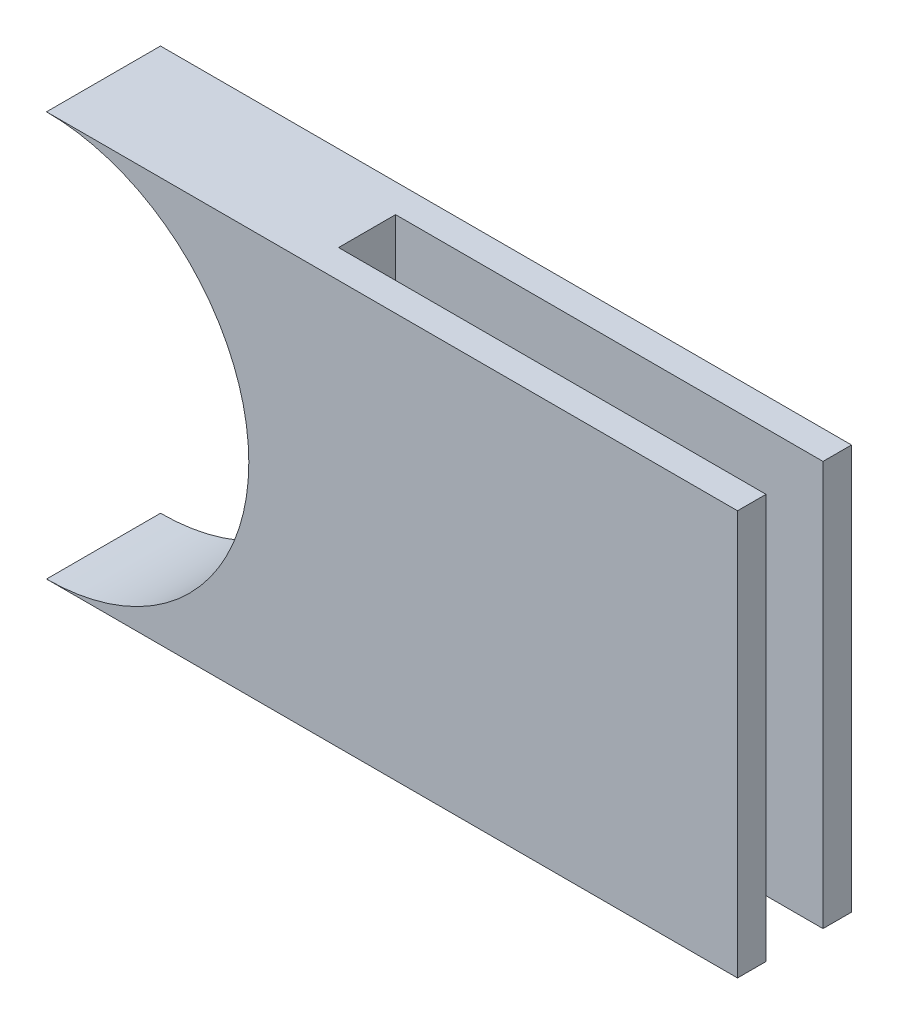
ISO-10303-21;
HEADER;
FILE_DESCRIPTION(('STEP AP214'),'2;1');
FILE_NAME('part.step','',(''),(''),'','','');
FILE_SCHEMA(('AUTOMOTIVE_DESIGN { 1 0 10303 214 1 1 1 1 }'));
ENDSEC;
DATA;
#1=APPLICATION_CONTEXT('core data for automotive mechanical design processes');
#2=APPLICATION_PROTOCOL_DEFINITION('international standard','automotive_design',2000,#1);
#3=PRODUCT_CONTEXT('',#1,'mechanical');
#4=PRODUCT('Part','Part','',(#3));
#5=PRODUCT_RELATED_PRODUCT_CATEGORY('part','',(#4));
#6=PRODUCT_DEFINITION_FORMATION('','',#4);
#7=PRODUCT_DEFINITION_CONTEXT('part definition',#1,'design');
#8=PRODUCT_DEFINITION('design','',#6,#7);
#9=PRODUCT_DEFINITION_SHAPE('','',#8);
#10=(LENGTH_UNIT() NAMED_UNIT(*) SI_UNIT(.MILLI.,.METRE.));
#11=(NAMED_UNIT(*) PLANE_ANGLE_UNIT() SI_UNIT($,.RADIAN.));
#12=(NAMED_UNIT(*) SI_UNIT($,.STERADIAN.) SOLID_ANGLE_UNIT());
#13=UNCERTAINTY_MEASURE_WITH_UNIT(LENGTH_MEASURE(1.E-05),#10,'distance_accuracy_value','');
#14=(GEOMETRIC_REPRESENTATION_CONTEXT(3) GLOBAL_UNCERTAINTY_ASSIGNED_CONTEXT((#13)) GLOBAL_UNIT_ASSIGNED_CONTEXT((#10,
#11,#12)) REPRESENTATION_CONTEXT('',''));
#15=CARTESIAN_POINT('',(0.,0.,0.));
#16=DIRECTION('',(0.,0.,1.));
#17=DIRECTION('',(1.,0.,0.));
#18=AXIS2_PLACEMENT_3D('',#15,#16,#17);
#19=CARTESIAN_POINT('',(61.595,18.034,0.));
#20=DIRECTION('',(1.,0.,0.));
#21=DIRECTION('',(0.,1.,0.));
#22=AXIS2_PLACEMENT_3D('',#19,#20,#21);
#23=PLANE('',#22);
#24=DIRECTION('',(0.,-1.,0.));
#25=VECTOR('',#24,1.);
#26=CARTESIAN_POINT('',(61.595,-18.034,5.08));
#27=LINE('',#26,#25);
#28=CARTESIAN_POINT('',(61.595,18.034,5.08));
#29=VERTEX_POINT('',#28);
#30=CARTESIAN_POINT('',(61.595,-18.034,5.08));
#31=VERTEX_POINT('',#30);
#32=EDGE_CURVE('E172',#29,#31,#27,.T.);
#33=ORIENTED_EDGE('',*,*,#32,.F.);
#34=DIRECTION('',(0.,0.,1.));
#35=VECTOR('',#34,1.);
#36=CARTESIAN_POINT('',(61.595,18.034,0.));
#37=LINE('',#36,#35);
#38=CARTESIAN_POINT('',(61.595,18.034,7.62));
#39=VERTEX_POINT('',#38);
#40=EDGE_CURVE('E149',#29,#39,#37,.T.);
#41=ORIENTED_EDGE('',*,*,#40,.T.);
#42=DIRECTION('',(0.,1.,0.));
#43=VECTOR('',#42,1.);
#44=CARTESIAN_POINT('',(61.595,18.034,7.62));
#45=LINE('',#44,#43);
#46=CARTESIAN_POINT('',(61.595,-18.034,7.62));
#47=VERTEX_POINT('',#46);
#48=EDGE_CURVE('E138',#47,#39,#45,.T.);
#49=ORIENTED_EDGE('',*,*,#48,.F.);
#50=DIRECTION('',(0.,0.,1.));
#51=VECTOR('',#50,1.);
#52=CARTESIAN_POINT('',(61.595,-18.034,0.));
#53=LINE('',#52,#51);
#54=EDGE_CURVE('E150',#31,#47,#53,.T.);
#55=ORIENTED_EDGE('',*,*,#54,.F.);
#56=EDGE_LOOP('',(#33,#41,#49,#55));
#57=FACE_BOUND('',#56,.T.);
#58=ADVANCED_FACE('F34',(#57),#23,.T.);
#59=CARTESIAN_POINT('',(0.,0.,7.62));
#60=DIRECTION('',(0.,0.,1.));
#61=DIRECTION('',(1.,0.,0.));
#62=AXIS2_PLACEMENT_3D('',#59,#60,#61);
#63=PLANE('',#62);
#64=ORIENTED_EDGE('',*,*,#48,.T.);
#65=DIRECTION('',(-1.,0.,0.));
#66=VECTOR('',#65,1.);
#67=CARTESIAN_POINT('',(0.,18.034,7.62));
#68=LINE('',#67,#66);
#69=CARTESIAN_POINT('',(0.,18.034,7.62));
#70=VERTEX_POINT('',#69);
#71=EDGE_CURVE('E141',#39,#70,#68,.T.);
#72=ORIENTED_EDGE('',*,*,#71,.T.);
#73=CARTESIAN_POINT('',(0.,0.,7.62));
#74=DIRECTION('',(0.,0.,1.));
#75=DIRECTION('',(1.,0.,0.));
#76=AXIS2_PLACEMENT_3D('',#73,#74,#75);
#77=CIRCLE('',#76,18.034);
#78=CARTESIAN_POINT('',(0.,-18.034,7.62));
#79=VERTEX_POINT('',#78);
#80=EDGE_CURVE('E12',#79,#70,#77,.T.);
#81=ORIENTED_EDGE('',*,*,#80,.F.);
#82=DIRECTION('',(1.,0.,0.));
#83=VECTOR('',#82,1.);
#84=CARTESIAN_POINT('',(0.,-18.034,7.62));
#85=LINE('',#84,#83);
#86=EDGE_CURVE('E57',#79,#47,#85,.T.);
#87=ORIENTED_EDGE('',*,*,#86,.T.);
#88=EDGE_LOOP('',(#64,#72,#81,#87));
#89=FACE_BOUND('',#88,.T.);
#90=ADVANCED_FACE('F36',(#89),#63,.T.);
#91=CARTESIAN_POINT('',(0.,0.,0.));
#92=DIRECTION('',(0.,0.,1.));
#93=DIRECTION('',(1.,0.,0.));
#94=AXIS2_PLACEMENT_3D('',#91,#92,#93);
#95=CYLINDRICAL_SURFACE('',#94,18.034);
#96=ORIENTED_EDGE('',*,*,#80,.T.);
#97=DIRECTION('',(0.,0.,1.));
#98=VECTOR('',#97,1.);
#99=CARTESIAN_POINT('',(0.,18.034,0.));
#100=LINE('',#99,#98);
#101=CARTESIAN_POINT('',(0.,18.034,-2.54));
#102=VERTEX_POINT('',#101);
#103=EDGE_CURVE('E42',#102,#70,#100,.T.);
#104=ORIENTED_EDGE('',*,*,#103,.F.);
#105=CARTESIAN_POINT('',(0.,0.,-2.54));
#106=DIRECTION('',(0.,0.,1.));
#107=DIRECTION('',(-1.,0.,0.));
#108=AXIS2_PLACEMENT_3D('',#105,#106,#107);
#109=CIRCLE('',#108,18.034);
#110=CARTESIAN_POINT('',(0.,-18.034,-2.54));
#111=VERTEX_POINT('',#110);
#112=EDGE_CURVE('E125',#111,#102,#109,.T.);
#113=ORIENTED_EDGE('',*,*,#112,.F.);
#114=DIRECTION('',(0.,0.,1.));
#115=VECTOR('',#114,1.);
#116=CARTESIAN_POINT('',(0.,-18.034,0.));
#117=LINE('',#116,#115);
#118=EDGE_CURVE('E144',#111,#79,#117,.T.);
#119=ORIENTED_EDGE('',*,*,#118,.T.);
#120=EDGE_LOOP('',(#96,#104,#113,#119));
#121=FACE_BOUND('',#120,.T.);
#122=ADVANCED_FACE('F161',(#121),#95,.F.);
#123=CARTESIAN_POINT('',(0.,18.034,0.));
#124=DIRECTION('',(0.,1.,0.));
#125=DIRECTION('',(0.,0.,1.));
#126=AXIS2_PLACEMENT_3D('',#123,#124,#125);
#127=PLANE('',#126);
#128=DIRECTION('',(1.,0.,0.));
#129=VECTOR('',#128,1.);
#130=CARTESIAN_POINT('',(23.495,18.034,5.08));
#131=LINE('',#130,#129);
#132=CARTESIAN_POINT('',(23.495,18.034,5.08));
#133=VERTEX_POINT('',#132);
#134=EDGE_CURVE('E120',#133,#29,#131,.T.);
#135=ORIENTED_EDGE('',*,*,#134,.F.);
#136=DIRECTION('',(0.,0.,1.));
#137=VECTOR('',#136,1.);
#138=CARTESIAN_POINT('',(23.495,18.034,0.));
#139=LINE('',#138,#137);
#140=CARTESIAN_POINT('',(23.495,18.034,0.));
#141=VERTEX_POINT('',#140);
#142=EDGE_CURVE('E107',#141,#133,#139,.T.);
#143=ORIENTED_EDGE('',*,*,#142,.F.);
#144=DIRECTION('',(1.,0.,0.));
#145=VECTOR('',#144,1.);
#146=CARTESIAN_POINT('',(23.495,18.034,0.));
#147=LINE('',#146,#145);
#148=CARTESIAN_POINT('',(61.595,18.034,0.));
#149=VERTEX_POINT('',#148);
#150=EDGE_CURVE('E105',#141,#149,#147,.T.);
#151=ORIENTED_EDGE('',*,*,#150,.T.);
#152=CARTESIAN_POINT('',(61.595,18.034,-2.54));
#153=VERTEX_POINT('',#152);
#154=EDGE_CURVE('E146',#153,#149,#37,.T.);
#155=ORIENTED_EDGE('',*,*,#154,.F.);
#156=DIRECTION('',(1.,0.,0.));
#157=VECTOR('',#156,1.);
#158=CARTESIAN_POINT('',(0.,18.034,-2.54));
#159=LINE('',#158,#157);
#160=EDGE_CURVE('E128',#102,#153,#159,.T.);
#161=ORIENTED_EDGE('',*,*,#160,.F.);
#162=ORIENTED_EDGE('',*,*,#103,.T.);
#163=ORIENTED_EDGE('',*,*,#71,.F.);
#164=ORIENTED_EDGE('',*,*,#40,.F.);
#165=EDGE_LOOP('',(#135,#143,#151,#155,#161,#162,#163,#164));
#166=FACE_BOUND('',#165,.T.);
#167=ADVANCED_FACE('F165',(#166),#127,.T.);
#168=DIRECTION('',(0.,1.,0.));
#169=VECTOR('',#168,1.);
#170=CARTESIAN_POINT('',(61.595,-18.034,0.));
#171=LINE('',#170,#169);
#172=CARTESIAN_POINT('',(61.595,-18.034,0.));
#173=VERTEX_POINT('',#172);
#174=EDGE_CURVE('E171',#173,#149,#171,.T.);
#175=ORIENTED_EDGE('',*,*,#174,.F.);
#176=CARTESIAN_POINT('',(61.595,-18.034,-2.54));
#177=VERTEX_POINT('',#176);
#178=EDGE_CURVE('E117',#177,#173,#53,.T.);
#179=ORIENTED_EDGE('',*,*,#178,.F.);
#180=DIRECTION('',(0.,-1.,0.));
#181=VECTOR('',#180,1.);
#182=CARTESIAN_POINT('',(61.595,18.034,-2.54));
#183=LINE('',#182,#181);
#184=EDGE_CURVE('E131',#153,#177,#183,.T.);
#185=ORIENTED_EDGE('',*,*,#184,.F.);
#186=ORIENTED_EDGE('',*,*,#154,.T.);
#187=EDGE_LOOP('',(#175,#179,#185,#186));
#188=FACE_BOUND('',#187,.T.);
#189=ADVANCED_FACE('F170',(#188),#23,.T.);
#190=CARTESIAN_POINT('',(0.,-18.034,0.));
#191=DIRECTION('',(0.,-1.,0.));
#192=DIRECTION('',(0.,0.,-1.));
#193=AXIS2_PLACEMENT_3D('',#190,#191,#192);
#194=PLANE('',#193);
#195=DIRECTION('',(1.,0.,0.));
#196=VECTOR('',#195,1.);
#197=CARTESIAN_POINT('',(23.495,-18.034,5.08));
#198=LINE('',#197,#196);
#199=CARTESIAN_POINT('',(23.495,-18.034,5.08));
#200=VERTEX_POINT('',#199);
#201=EDGE_CURVE('E118',#200,#31,#198,.T.);
#202=ORIENTED_EDGE('',*,*,#201,.T.);
#203=ORIENTED_EDGE('',*,*,#54,.T.);
#204=ORIENTED_EDGE('',*,*,#86,.F.);
#205=ORIENTED_EDGE('',*,*,#118,.F.);
#206=DIRECTION('',(-1.,0.,0.));
#207=VECTOR('',#206,1.);
#208=CARTESIAN_POINT('',(61.595,-18.034,-2.54));
#209=LINE('',#208,#207);
#210=EDGE_CURVE('E134',#177,#111,#209,.T.);
#211=ORIENTED_EDGE('',*,*,#210,.F.);
#212=ORIENTED_EDGE('',*,*,#178,.T.);
#213=DIRECTION('',(1.,0.,0.));
#214=VECTOR('',#213,1.);
#215=CARTESIAN_POINT('',(23.495,-18.034,0.));
#216=LINE('',#215,#214);
#217=CARTESIAN_POINT('',(23.495,-18.034,0.));
#218=VERTEX_POINT('',#217);
#219=EDGE_CURVE('E102',#218,#173,#216,.T.);
#220=ORIENTED_EDGE('',*,*,#219,.F.);
#221=DIRECTION('',(0.,0.,-1.));
#222=VECTOR('',#221,1.);
#223=CARTESIAN_POINT('',(23.495,-18.034,0.));
#224=LINE('',#223,#222);
#225=EDGE_CURVE('E108',#200,#218,#224,.T.);
#226=ORIENTED_EDGE('',*,*,#225,.F.);
#227=EDGE_LOOP('',(#202,#203,#204,#205,#211,#212,#220,#226));
#228=FACE_BOUND('',#227,.T.);
#229=ADVANCED_FACE('F115',(#228),#194,.T.);
#230=CARTESIAN_POINT('',(0.,0.,-2.54));
#231=DIRECTION('',(0.,0.,-1.));
#232=DIRECTION('',(-1.,0.,0.));
#233=AXIS2_PLACEMENT_3D('',#230,#231,#232);
#234=PLANE('',#233);
#235=ORIENTED_EDGE('',*,*,#112,.T.);
#236=ORIENTED_EDGE('',*,*,#160,.T.);
#237=ORIENTED_EDGE('',*,*,#184,.T.);
#238=ORIENTED_EDGE('',*,*,#210,.T.);
#239=EDGE_LOOP('',(#235,#236,#237,#238));
#240=FACE_BOUND('',#239,.T.);
#241=ADVANCED_FACE('F168',(#240),#234,.T.);
#242=CARTESIAN_POINT('',(23.495,-18.034,5.08));
#243=DIRECTION('',(0.,0.,1.));
#244=DIRECTION('',(1.,0.,0.));
#245=AXIS2_PLACEMENT_3D('',#242,#243,#244);
#246=PLANE('',#245);
#247=ORIENTED_EDGE('',*,*,#32,.T.);
#248=ORIENTED_EDGE('',*,*,#201,.F.);
#249=DIRECTION('',(0.,-1.,0.));
#250=VECTOR('',#249,1.);
#251=CARTESIAN_POINT('',(23.495,-18.034,5.08));
#252=LINE('',#251,#250);
#253=EDGE_CURVE('E49',#133,#200,#252,.T.);
#254=ORIENTED_EDGE('',*,*,#253,.F.);
#255=ORIENTED_EDGE('',*,*,#134,.T.);
#256=EDGE_LOOP('',(#247,#248,#254,#255));
#257=FACE_BOUND('',#256,.T.);
#258=ADVANCED_FACE('F179',(#257),#246,.F.);
#259=CARTESIAN_POINT('',(23.495,-18.034,0.));
#260=DIRECTION('',(0.,0.,-1.));
#261=DIRECTION('',(-1.,0.,0.));
#262=AXIS2_PLACEMENT_3D('',#259,#260,#261);
#263=PLANE('',#262);
#264=ORIENTED_EDGE('',*,*,#174,.T.);
#265=ORIENTED_EDGE('',*,*,#150,.F.);
#266=DIRECTION('',(0.,1.,0.));
#267=VECTOR('',#266,1.);
#268=CARTESIAN_POINT('',(23.495,-18.034,0.));
#269=LINE('',#268,#267);
#270=EDGE_CURVE('E99',#218,#141,#269,.T.);
#271=ORIENTED_EDGE('',*,*,#270,.F.);
#272=ORIENTED_EDGE('',*,*,#219,.T.);
#273=EDGE_LOOP('',(#264,#265,#271,#272));
#274=FACE_BOUND('',#273,.T.);
#275=ADVANCED_FACE('F100',(#274),#263,.F.);
#276=CARTESIAN_POINT('',(23.495,0.,0.));
#277=DIRECTION('',(1.,0.,0.));
#278=DIRECTION('',(0.,0.,-1.));
#279=AXIS2_PLACEMENT_3D('',#276,#277,#278);
#280=PLANE('',#279);
#281=CARTESIAN_POINT('',(23.495,0.,2.54));
#282=DIRECTION('',(1.,0.,0.));
#283=DIRECTION('',(0.,0.,-1.));
#284=AXIS2_PLACEMENT_3D('',#281,#282,#283);
#285=CIRCLE('',#284,1.905);
#286=CARTESIAN_POINT('',(23.495,0.,0.634999999999999));
#287=VERTEX_POINT('',#286);
#288=EDGE_CURVE('E181',#287,#287,#285,.T.);
#289=ORIENTED_EDGE('',*,*,#288,.F.);
#290=EDGE_LOOP('',(#289));
#291=FACE_BOUND('',#290,.T.);
#292=ORIENTED_EDGE('',*,*,#253,.T.);
#293=ORIENTED_EDGE('',*,*,#225,.T.);
#294=ORIENTED_EDGE('',*,*,#270,.T.);
#295=ORIENTED_EDGE('',*,*,#142,.T.);
#296=EDGE_LOOP('',(#292,#293,#294,#295));
#297=FACE_BOUND('',#296,.T.);
#298=ADVANCED_FACE('F111',(#291,#297),#280,.T.);
#299=CARTESIAN_POINT('',(26.035,0.,2.54));
#300=DIRECTION('',(-1.,0.,0.));
#301=DIRECTION('',(0.,0.,1.));
#302=AXIS2_PLACEMENT_3D('',#299,#300,#301);
#303=CYLINDRICAL_SURFACE('',#302,1.905);
#304=CARTESIAN_POINT('',(26.035,0.,2.54));
#305=DIRECTION('',(1.,0.,0.));
#306=DIRECTION('',(0.,0.,-1.));
#307=AXIS2_PLACEMENT_3D('',#304,#305,#306);
#308=CIRCLE('',#307,1.905);
#309=CARTESIAN_POINT('',(26.035,0.,0.634999999999999));
#310=VERTEX_POINT('',#309);
#311=EDGE_CURVE('E175',#310,#310,#308,.T.);
#312=ORIENTED_EDGE('',*,*,#311,.F.);
#313=EDGE_LOOP('',(#312));
#314=FACE_BOUND('',#313,.T.);
#315=ORIENTED_EDGE('',*,*,#288,.T.);
#316=EDGE_LOOP('',(#315));
#317=FACE_BOUND('',#316,.T.);
#318=ADVANCED_FACE('F189',(#314,#317),#303,.T.);
#319=CARTESIAN_POINT('',(26.035,0.,2.54));
#320=DIRECTION('',(1.,0.,0.));
#321=DIRECTION('',(0.,0.,-1.));
#322=AXIS2_PLACEMENT_3D('',#319,#320,#321);
#323=PLANE('',#322);
#324=ORIENTED_EDGE('',*,*,#311,.T.);
#325=EDGE_LOOP('',(#324));
#326=FACE_BOUND('',#325,.T.);
#327=ADVANCED_FACE('F187',(#326),#323,.T.);
#328=CLOSED_SHELL('',(#58,#90,#122,#167,#189,#229,#241,#258,#275,#298,#318,#327));
#329=MANIFOLD_SOLID_BREP('B2',#328);
#330=ADVANCED_BREP_SHAPE_REPRESENTATION('',(#18,#329),#14);
#331=SHAPE_DEFINITION_REPRESENTATION(#9,#330);
ENDSEC;
END-ISO-10303-21;
